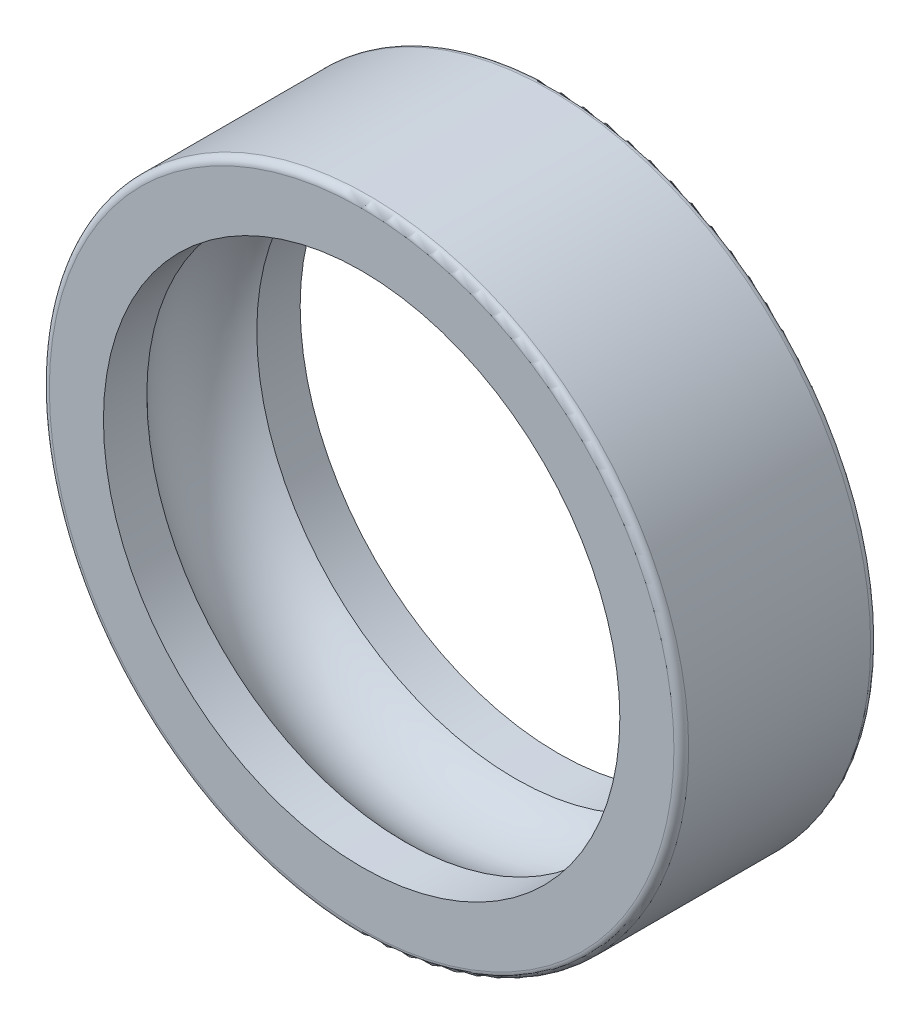
ISO-10303-21;
HEADER;
FILE_DESCRIPTION(('STEP AP214'),'2;1');
FILE_NAME('part.step','',(''),(''),'','','');
FILE_SCHEMA(('AUTOMOTIVE_DESIGN { 1 0 10303 214 1 1 1 1 }'));
ENDSEC;
DATA;
#1=APPLICATION_CONTEXT('core data for automotive mechanical design processes');
#2=APPLICATION_PROTOCOL_DEFINITION('international standard','automotive_design',2000,#1);
#3=PRODUCT_CONTEXT('',#1,'mechanical');
#4=PRODUCT('Part','Part','',(#3));
#5=PRODUCT_RELATED_PRODUCT_CATEGORY('part','',(#4));
#6=PRODUCT_DEFINITION_FORMATION('','',#4);
#7=PRODUCT_DEFINITION_CONTEXT('part definition',#1,'design');
#8=PRODUCT_DEFINITION('design','',#6,#7);
#9=PRODUCT_DEFINITION_SHAPE('','',#8);
#10=(LENGTH_UNIT() NAMED_UNIT(*) SI_UNIT(.MILLI.,.METRE.));
#11=(NAMED_UNIT(*) PLANE_ANGLE_UNIT() SI_UNIT($,.RADIAN.));
#12=(NAMED_UNIT(*) SI_UNIT($,.STERADIAN.) SOLID_ANGLE_UNIT());
#13=UNCERTAINTY_MEASURE_WITH_UNIT(LENGTH_MEASURE(1.E-05),#10,'distance_accuracy_value','');
#14=(GEOMETRIC_REPRESENTATION_CONTEXT(3) GLOBAL_UNCERTAINTY_ASSIGNED_CONTEXT((#13)) GLOBAL_UNIT_ASSIGNED_CONTEXT((#10,
#11,#12)) REPRESENTATION_CONTEXT('',''));
#15=CARTESIAN_POINT('',(0.,0.,0.));
#16=DIRECTION('',(0.,0.,1.));
#17=DIRECTION('',(1.,0.,0.));
#18=AXIS2_PLACEMENT_3D('',#15,#16,#17);
#19=CARTESIAN_POINT('',(0.,0.,8.51612903225807));
#20=DIRECTION('',(0.,0.,1.));
#21=DIRECTION('',(1.,0.,0.));
#22=AXIS2_PLACEMENT_3D('',#19,#20,#21);
#23=CYLINDRICAL_SURFACE('',#22,10.5);
#24=CARTESIAN_POINT('',(0.,0.,-4.));
#25=DIRECTION('',(0.,0.,1.));
#26=DIRECTION('',(1.,0.,0.));
#27=AXIS2_PLACEMENT_3D('',#24,#25,#26);
#28=CIRCLE('',#27,10.5);
#29=CARTESIAN_POINT('',(10.5,0.,-4.));
#30=VERTEX_POINT('',#29);
#31=EDGE_CURVE('E58',#30,#30,#28,.T.);
#32=ORIENTED_EDGE('',*,*,#31,.F.);
#33=EDGE_LOOP('',(#32));
#34=FACE_BOUND('',#33,.T.);
#35=CARTESIAN_POINT('',(0.,0.,-2.23606797749979));
#36=DIRECTION('',(0.,0.,1.));
#37=DIRECTION('',(1.,0.,0.));
#38=AXIS2_PLACEMENT_3D('',#35,#36,#37);
#39=CIRCLE('',#38,10.5);
#40=CARTESIAN_POINT('',(10.5,0.,-2.23606797749979));
#41=VERTEX_POINT('',#40);
#42=EDGE_CURVE('E10',#41,#41,#39,.T.);
#43=ORIENTED_EDGE('',*,*,#42,.T.);
#44=EDGE_LOOP('',(#43));
#45=FACE_BOUND('',#44,.T.);
#46=ADVANCED_FACE('F30',(#34,#45),#23,.F.);
#47=CARTESIAN_POINT('',(0.,0.,0.));
#48=DIRECTION('',(0.,0.,1.));
#49=DIRECTION('',(1.,0.,0.));
#50=AXIS2_PLACEMENT_3D('',#47,#48,#49);
#51=TOROIDAL_SURFACE('',#50,8.5,3.);
#52=ORIENTED_EDGE('',*,*,#42,.F.);
#53=EDGE_LOOP('',(#52));
#54=FACE_BOUND('',#53,.T.);
#55=CARTESIAN_POINT('',(0.,0.,2.23606797749979));
#56=DIRECTION('',(0.,0.,1.));
#57=DIRECTION('',(1.,0.,0.));
#58=AXIS2_PLACEMENT_3D('',#55,#56,#57);
#59=CIRCLE('',#58,10.5);
#60=CARTESIAN_POINT('',(10.5,0.,2.23606797749979));
#61=VERTEX_POINT('',#60);
#62=EDGE_CURVE('E36',#61,#61,#59,.T.);
#63=ORIENTED_EDGE('',*,*,#62,.T.);
#64=EDGE_LOOP('',(#63));
#65=FACE_BOUND('',#64,.T.);
#66=ADVANCED_FACE('F65',(#54,#65),#51,.F.);
#67=CARTESIAN_POINT('',(0.,0.,8.51612903225807));
#68=DIRECTION('',(0.,0.,1.));
#69=DIRECTION('',(1.,0.,0.));
#70=AXIS2_PLACEMENT_3D('',#67,#68,#69);
#71=CYLINDRICAL_SURFACE('',#70,10.5);
#72=ORIENTED_EDGE('',*,*,#62,.F.);
#73=EDGE_LOOP('',(#72));
#74=FACE_BOUND('',#73,.T.);
#75=CARTESIAN_POINT('',(0.,0.,4.));
#76=DIRECTION('',(0.,0.,1.));
#77=DIRECTION('',(1.,0.,0.));
#78=AXIS2_PLACEMENT_3D('',#75,#76,#77);
#79=CIRCLE('',#78,10.5);
#80=CARTESIAN_POINT('',(10.5,0.,4.));
#81=VERTEX_POINT('',#80);
#82=EDGE_CURVE('E40',#81,#81,#79,.T.);
#83=ORIENTED_EDGE('',*,*,#82,.T.);
#84=EDGE_LOOP('',(#83));
#85=FACE_BOUND('',#84,.T.);
#86=ADVANCED_FACE('F69',(#74,#85),#71,.F.);
#87=CARTESIAN_POINT('',(0.,12.7,4.));
#88=DIRECTION('',(0.,0.,-1.));
#89=DIRECTION('',(-1.,0.,0.));
#90=AXIS2_PLACEMENT_3D('',#87,#88,#89);
#91=PLANE('',#90);
#92=ORIENTED_EDGE('',*,*,#82,.F.);
#93=EDGE_LOOP('',(#92));
#94=FACE_BOUND('',#93,.T.);
#95=CARTESIAN_POINT('',(0.,0.,4.));
#96=DIRECTION('',(0.,0.,1.));
#97=DIRECTION('',(1.,0.,0.));
#98=AXIS2_PLACEMENT_3D('',#95,#96,#97);
#99=CIRCLE('',#98,12.7);
#100=CARTESIAN_POINT('',(12.7,0.,4.));
#101=VERTEX_POINT('',#100);
#102=EDGE_CURVE('E44',#101,#101,#99,.T.);
#103=ORIENTED_EDGE('',*,*,#102,.T.);
#104=EDGE_LOOP('',(#103));
#105=FACE_BOUND('',#104,.T.);
#106=ADVANCED_FACE('F74',(#94,#105),#91,.F.);
#107=CARTESIAN_POINT('',(0.,0.,3.7));
#108=DIRECTION('',(0.,0.,1.));
#109=DIRECTION('',(1.,0.,0.));
#110=AXIS2_PLACEMENT_3D('',#107,#108,#109);
#111=TOROIDAL_SURFACE('',#110,12.7,0.3);
#112=ORIENTED_EDGE('',*,*,#102,.F.);
#113=EDGE_LOOP('',(#112));
#114=FACE_BOUND('',#113,.T.);
#115=CARTESIAN_POINT('',(0.,0.,3.7));
#116=DIRECTION('',(0.,0.,1.));
#117=DIRECTION('',(1.,0.,0.));
#118=AXIS2_PLACEMENT_3D('',#115,#116,#117);
#119=CIRCLE('',#118,13.);
#120=CARTESIAN_POINT('',(13.,0.,3.7));
#121=VERTEX_POINT('',#120);
#122=EDGE_CURVE('E49',#121,#121,#119,.T.);
#123=ORIENTED_EDGE('',*,*,#122,.T.);
#124=EDGE_LOOP('',(#123));
#125=FACE_BOUND('',#124,.T.);
#126=ADVANCED_FACE('F80',(#114,#125),#111,.T.);
#127=CARTESIAN_POINT('',(0.,0.,8.51612903225807));
#128=DIRECTION('',(0.,0.,1.));
#129=DIRECTION('',(1.,0.,0.));
#130=AXIS2_PLACEMENT_3D('',#127,#128,#129);
#131=CYLINDRICAL_SURFACE('',#130,13.);
#132=ORIENTED_EDGE('',*,*,#122,.F.);
#133=EDGE_LOOP('',(#132));
#134=FACE_BOUND('',#133,.T.);
#135=CARTESIAN_POINT('',(0.,0.,-3.7));
#136=DIRECTION('',(0.,0.,1.));
#137=DIRECTION('',(1.,0.,0.));
#138=AXIS2_PLACEMENT_3D('',#135,#136,#137);
#139=CIRCLE('',#138,13.);
#140=CARTESIAN_POINT('',(13.,0.,-3.7));
#141=VERTEX_POINT('',#140);
#142=EDGE_CURVE('E52',#141,#141,#139,.T.);
#143=ORIENTED_EDGE('',*,*,#142,.T.);
#144=EDGE_LOOP('',(#143));
#145=FACE_BOUND('',#144,.T.);
#146=ADVANCED_FACE('F84',(#134,#145),#131,.T.);
#147=CARTESIAN_POINT('',(0.,0.,-3.7));
#148=DIRECTION('',(0.,0.,1.));
#149=DIRECTION('',(1.,0.,0.));
#150=AXIS2_PLACEMENT_3D('',#147,#148,#149);
#151=TOROIDAL_SURFACE('',#150,12.7,0.299999999999999);
#152=ORIENTED_EDGE('',*,*,#142,.F.);
#153=EDGE_LOOP('',(#152));
#154=FACE_BOUND('',#153,.T.);
#155=CARTESIAN_POINT('',(0.,0.,-4.));
#156=DIRECTION('',(0.,0.,1.));
#157=DIRECTION('',(1.,0.,0.));
#158=AXIS2_PLACEMENT_3D('',#155,#156,#157);
#159=CIRCLE('',#158,12.7);
#160=CARTESIAN_POINT('',(12.7,0.,-4.));
#161=VERTEX_POINT('',#160);
#162=EDGE_CURVE('E55',#161,#161,#159,.T.);
#163=ORIENTED_EDGE('',*,*,#162,.T.);
#164=EDGE_LOOP('',(#163));
#165=FACE_BOUND('',#164,.T.);
#166=ADVANCED_FACE('F88',(#154,#165),#151,.T.);
#167=CARTESIAN_POINT('',(0.,12.7,-4.));
#168=DIRECTION('',(0.,0.,1.));
#169=DIRECTION('',(1.,0.,0.));
#170=AXIS2_PLACEMENT_3D('',#167,#168,#169);
#171=PLANE('',#170);
#172=ORIENTED_EDGE('',*,*,#162,.F.);
#173=EDGE_LOOP('',(#172));
#174=FACE_BOUND('',#173,.T.);
#175=ORIENTED_EDGE('',*,*,#31,.T.);
#176=EDGE_LOOP('',(#175));
#177=FACE_BOUND('',#176,.T.);
#178=ADVANCED_FACE('F62',(#174,#177),#171,.F.);
#179=CLOSED_SHELL('',(#46,#66,#86,#106,#126,#146,#166,#178));
#180=MANIFOLD_SOLID_BREP('B2',#179);
#181=ADVANCED_BREP_SHAPE_REPRESENTATION('',(#18,#180),#14);
#182=SHAPE_DEFINITION_REPRESENTATION(#9,#181);
ENDSEC;
END-ISO-10303-21;
